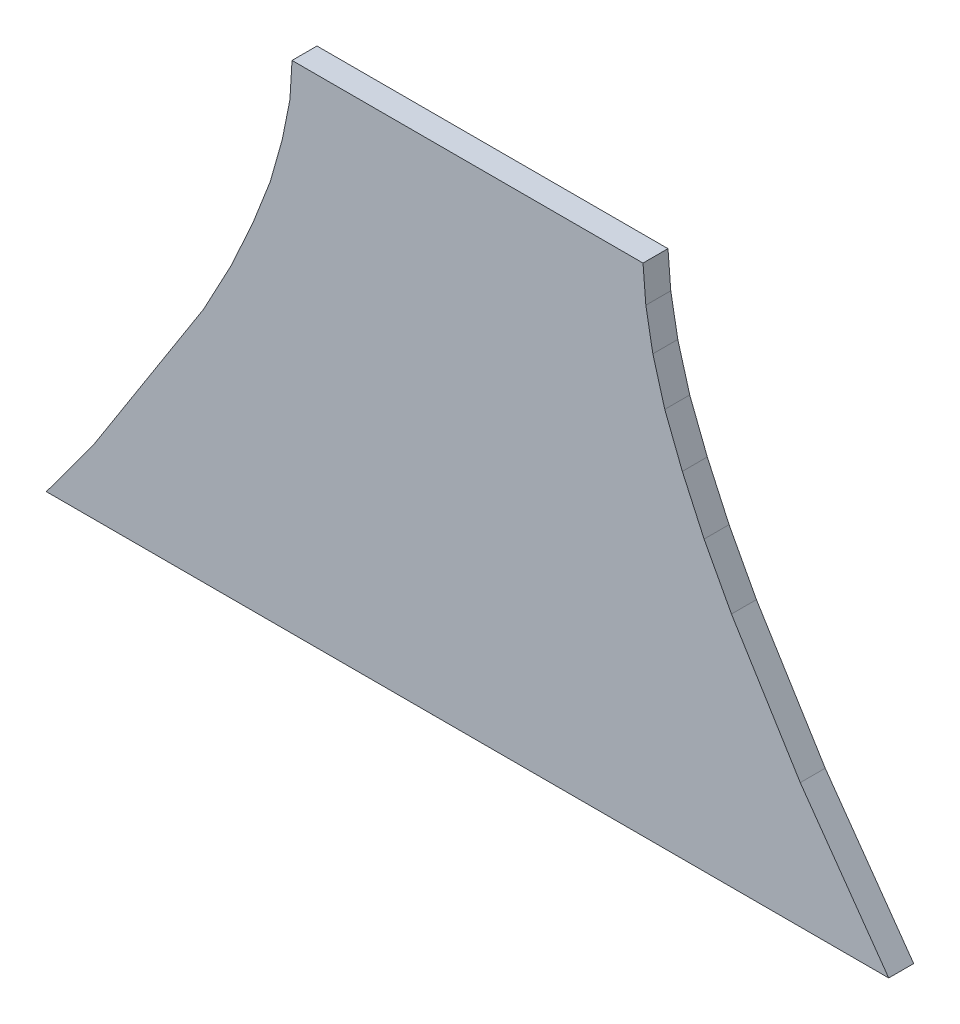
ISO-10303-21;
HEADER;
FILE_DESCRIPTION(('STEP AP214'),'2;1');
FILE_NAME('part.step','',(''),(''),'','','');
FILE_SCHEMA(('AUTOMOTIVE_DESIGN { 1 0 10303 214 1 1 1 1 }'));
ENDSEC;
DATA;
#1=APPLICATION_CONTEXT('core data for automotive mechanical design processes');
#2=APPLICATION_PROTOCOL_DEFINITION('international standard','automotive_design',2000,#1);
#3=PRODUCT_CONTEXT('',#1,'mechanical');
#4=PRODUCT('Part','Part','',(#3));
#5=PRODUCT_RELATED_PRODUCT_CATEGORY('part','',(#4));
#6=PRODUCT_DEFINITION_FORMATION('','',#4);
#7=PRODUCT_DEFINITION_CONTEXT('part definition',#1,'design');
#8=PRODUCT_DEFINITION('design','',#6,#7);
#9=PRODUCT_DEFINITION_SHAPE('','',#8);
#10=(LENGTH_UNIT() NAMED_UNIT(*) SI_UNIT(.MILLI.,.METRE.));
#11=(NAMED_UNIT(*) PLANE_ANGLE_UNIT() SI_UNIT($,.RADIAN.));
#12=(NAMED_UNIT(*) SI_UNIT($,.STERADIAN.) SOLID_ANGLE_UNIT());
#13=UNCERTAINTY_MEASURE_WITH_UNIT(LENGTH_MEASURE(1.E-05),#10,'distance_accuracy_value','');
#14=(GEOMETRIC_REPRESENTATION_CONTEXT(3) GLOBAL_UNCERTAINTY_ASSIGNED_CONTEXT((#13)) GLOBAL_UNIT_ASSIGNED_CONTEXT((#10,
#11,#12)) REPRESENTATION_CONTEXT('',''));
#15=CARTESIAN_POINT('',(0.,0.,0.));
#16=DIRECTION('',(0.,0.,1.));
#17=DIRECTION('',(1.,0.,0.));
#18=AXIS2_PLACEMENT_3D('',#15,#16,#17);
#19=CARTESIAN_POINT('',(67.6500015258789,58.6570014953613,0.));
#20=DIRECTION('',(0.,-1.,0.));
#21=DIRECTION('',(-1.,0.,0.));
#22=AXIS2_PLACEMENT_3D('',#19,#20,#21);
#23=PLANE('',#22);
#24=DIRECTION('',(-1.,0.,0.));
#25=VECTOR('',#24,1.);
#26=CARTESIAN_POINT('',(67.6500015258789,58.6570014953613,0.03556));
#27=LINE('',#26,#25);
#28=CARTESIAN_POINT('',(67.6500015258789,58.6570014953613,0.03556));
#29=VERTEX_POINT('',#28);
#30=CARTESIAN_POINT('',(67.1500015258789,58.6570014953613,0.03556));
#31=VERTEX_POINT('',#30);
#32=EDGE_CURVE('E11',#29,#31,#27,.T.);
#33=ORIENTED_EDGE('',*,*,#32,.F.);
#34=DIRECTION('',(0.,0.,1.));
#35=VECTOR('',#34,1.);
#36=CARTESIAN_POINT('',(67.6500015258789,58.6570014953613,0.));
#37=LINE('',#36,#35);
#38=CARTESIAN_POINT('',(67.6500015258789,58.6570014953613,0.));
#39=VERTEX_POINT('',#38);
#40=EDGE_CURVE('E24',#39,#29,#37,.T.);
#41=ORIENTED_EDGE('',*,*,#40,.F.);
#42=DIRECTION('',(-1.,0.,0.));
#43=VECTOR('',#42,1.);
#44=CARTESIAN_POINT('',(67.6500015258789,58.6570014953613,0.));
#45=LINE('',#44,#43);
#46=CARTESIAN_POINT('',(67.1500015258789,58.6570014953613,0.));
#47=VERTEX_POINT('',#46);
#48=EDGE_CURVE('E311',#39,#47,#45,.T.);
#49=ORIENTED_EDGE('',*,*,#48,.T.);
#50=DIRECTION('',(0.,0.,1.));
#51=VECTOR('',#50,1.);
#52=CARTESIAN_POINT('',(67.1500015258789,58.6570014953613,0.));
#53=LINE('',#52,#51);
#54=EDGE_CURVE('E37',#47,#31,#53,.T.);
#55=ORIENTED_EDGE('',*,*,#54,.T.);
#56=EDGE_LOOP('',(#33,#41,#49,#55));
#57=FACE_BOUND('',#56,.T.);
#58=ADVANCED_FACE('F17',(#57),#23,.F.);
#59=CARTESIAN_POINT('',(67.6539993286133,58.6069984436035,0.));
#60=DIRECTION('',(-0.996819146189682,-0.0796968618558732,0.));
#61=DIRECTION('',(-0.0796968618558732,0.996819146189682,0.));
#62=AXIS2_PLACEMENT_3D('',#59,#60,#61);
#63=PLANE('',#62);
#64=DIRECTION('',(-0.0796968618558732,0.996819146189682,0.));
#65=VECTOR('',#64,1.);
#66=CARTESIAN_POINT('',(67.6539993286133,58.6069984436035,0.03556));
#67=LINE('',#66,#65);
#68=CARTESIAN_POINT('',(67.6539993286133,58.6069984436035,0.03556));
#69=VERTEX_POINT('',#68);
#70=EDGE_CURVE('E307',#69,#29,#67,.T.);
#71=ORIENTED_EDGE('',*,*,#70,.F.);
#72=DIRECTION('',(0.,0.,1.));
#73=VECTOR('',#72,1.);
#74=CARTESIAN_POINT('',(67.6539993286133,58.6069984436035,0.));
#75=LINE('',#74,#73);
#76=CARTESIAN_POINT('',(67.6539993286133,58.6069984436035,0.));
#77=VERTEX_POINT('',#76);
#78=EDGE_CURVE('E305',#77,#69,#75,.T.);
#79=ORIENTED_EDGE('',*,*,#78,.F.);
#80=DIRECTION('',(-0.0796968618558732,0.996819146189682,0.));
#81=VECTOR('',#80,1.);
#82=CARTESIAN_POINT('',(67.6539993286133,58.6069984436035,0.));
#83=LINE('',#82,#81);
#84=EDGE_CURVE('E303',#77,#39,#83,.T.);
#85=ORIENTED_EDGE('',*,*,#84,.T.);
#86=ORIENTED_EDGE('',*,*,#40,.T.);
#87=EDGE_LOOP('',(#71,#79,#85,#86));
#88=FACE_BOUND('',#87,.T.);
#89=ADVANCED_FACE('F314',(#88),#63,.F.);
#90=CARTESIAN_POINT('',(67.6640014648438,58.5519981384277,0.));
#91=DIRECTION('',(-0.983863358539756,-0.178921468032407,0.));
#92=DIRECTION('',(-0.178921468032407,0.983863358539756,0.));
#93=AXIS2_PLACEMENT_3D('',#90,#91,#92);
#94=PLANE('',#93);
#95=DIRECTION('',(-0.178921468032407,0.983863358539756,0.));
#96=VECTOR('',#95,1.);
#97=CARTESIAN_POINT('',(67.6640014648438,58.5519981384277,0.03556));
#98=LINE('',#97,#96);
#99=CARTESIAN_POINT('',(67.6640014648438,58.5519981384277,0.03556));
#100=VERTEX_POINT('',#99);
#101=EDGE_CURVE('E300',#100,#69,#98,.T.);
#102=ORIENTED_EDGE('',*,*,#101,.F.);
#103=DIRECTION('',(0.,0.,1.));
#104=VECTOR('',#103,1.);
#105=CARTESIAN_POINT('',(67.6640014648438,58.5519981384277,0.));
#106=LINE('',#105,#104);
#107=CARTESIAN_POINT('',(67.6640014648438,58.5519981384277,0.));
#108=VERTEX_POINT('',#107);
#109=EDGE_CURVE('E298',#108,#100,#106,.T.);
#110=ORIENTED_EDGE('',*,*,#109,.F.);
#111=DIRECTION('',(-0.178921468032407,0.983863358539756,0.));
#112=VECTOR('',#111,1.);
#113=CARTESIAN_POINT('',(67.6640014648438,58.5519981384277,0.));
#114=LINE('',#113,#112);
#115=EDGE_CURVE('E295',#108,#77,#114,.T.);
#116=ORIENTED_EDGE('',*,*,#115,.T.);
#117=ORIENTED_EDGE('',*,*,#78,.T.);
#118=EDGE_LOOP('',(#102,#110,#116,#117));
#119=FACE_BOUND('',#118,.T.);
#120=ADVANCED_FACE('F317',(#119),#94,.F.);
#121=CARTESIAN_POINT('',(67.6809997558594,58.492000579834,0.));
#122=DIRECTION('',(-0.962131004698203,-0.272587471829552,0.));
#123=DIRECTION('',(-0.272587471829552,0.962131004698203,0.));
#124=AXIS2_PLACEMENT_3D('',#121,#122,#123);
#125=PLANE('',#124);
#126=DIRECTION('',(-0.272587471829552,0.962131004698203,0.));
#127=VECTOR('',#126,1.);
#128=CARTESIAN_POINT('',(67.6809997558594,58.492000579834,0.03556));
#129=LINE('',#128,#127);
#130=CARTESIAN_POINT('',(67.6809997558594,58.492000579834,0.03556));
#131=VERTEX_POINT('',#130);
#132=EDGE_CURVE('E292',#131,#100,#129,.T.);
#133=ORIENTED_EDGE('',*,*,#132,.F.);
#134=DIRECTION('',(0.,0.,1.));
#135=VECTOR('',#134,1.);
#136=CARTESIAN_POINT('',(67.6809997558594,58.492000579834,0.));
#137=LINE('',#136,#135);
#138=CARTESIAN_POINT('',(67.6809997558594,58.492000579834,0.));
#139=VERTEX_POINT('',#138);
#140=EDGE_CURVE('E290',#139,#131,#137,.T.);
#141=ORIENTED_EDGE('',*,*,#140,.F.);
#142=DIRECTION('',(-0.272587471829552,0.962131004698203,0.));
#143=VECTOR('',#142,1.);
#144=CARTESIAN_POINT('',(67.6809997558594,58.492000579834,0.));
#145=LINE('',#144,#143);
#146=EDGE_CURVE('E287',#139,#108,#145,.T.);
#147=ORIENTED_EDGE('',*,*,#146,.T.);
#148=ORIENTED_EDGE('',*,*,#109,.T.);
#149=EDGE_LOOP('',(#133,#141,#147,#148));
#150=FACE_BOUND('',#149,.T.);
#151=ADVANCED_FACE('F322',(#150),#125,.F.);
#152=CARTESIAN_POINT('',(67.7060012817383,58.4280014038086,0.));
#153=DIRECTION('',(-0.931448235122396,-0.363873859032734,0.));
#154=DIRECTION('',(-0.363873859032734,0.931448235122396,0.));
#155=AXIS2_PLACEMENT_3D('',#152,#153,#154);
#156=PLANE('',#155);
#157=DIRECTION('',(-0.363873859032734,0.931448235122396,0.));
#158=VECTOR('',#157,1.);
#159=CARTESIAN_POINT('',(67.7060012817383,58.4280014038086,0.03556));
#160=LINE('',#159,#158);
#161=CARTESIAN_POINT('',(67.7060012817383,58.4280014038086,0.03556));
#162=VERTEX_POINT('',#161);
#163=EDGE_CURVE('E284',#162,#131,#160,.T.);
#164=ORIENTED_EDGE('',*,*,#163,.F.);
#165=DIRECTION('',(0.,0.,1.));
#166=VECTOR('',#165,1.);
#167=CARTESIAN_POINT('',(67.7060012817383,58.4280014038086,0.));
#168=LINE('',#167,#166);
#169=CARTESIAN_POINT('',(67.7060012817383,58.4280014038086,0.));
#170=VERTEX_POINT('',#169);
#171=EDGE_CURVE('E282',#170,#162,#168,.T.);
#172=ORIENTED_EDGE('',*,*,#171,.F.);
#173=DIRECTION('',(-0.363873859032734,0.931448235122396,0.));
#174=VECTOR('',#173,1.);
#175=CARTESIAN_POINT('',(67.7060012817383,58.4280014038086,0.));
#176=LINE('',#175,#174);
#177=EDGE_CURVE('E279',#170,#139,#176,.T.);
#178=ORIENTED_EDGE('',*,*,#177,.T.);
#179=ORIENTED_EDGE('',*,*,#140,.T.);
#180=EDGE_LOOP('',(#164,#172,#178,#179));
#181=FACE_BOUND('',#180,.T.);
#182=ADVANCED_FACE('F325',(#181),#156,.F.);
#183=CARTESIAN_POINT('',(67.7369995117188,58.3600006103516,0.));
#184=DIRECTION('',(-0.909918432077323,-0.414787230958169,0.));
#185=DIRECTION('',(-0.414787230958169,0.909918432077323,0.));
#186=AXIS2_PLACEMENT_3D('',#183,#184,#185);
#187=PLANE('',#186);
#188=DIRECTION('',(-0.414787230958169,0.909918432077323,0.));
#189=VECTOR('',#188,1.);
#190=CARTESIAN_POINT('',(67.7369995117188,58.3600006103516,0.03556));
#191=LINE('',#190,#189);
#192=CARTESIAN_POINT('',(67.7369995117188,58.3600006103516,0.03556));
#193=VERTEX_POINT('',#192);
#194=EDGE_CURVE('E276',#193,#162,#191,.T.);
#195=ORIENTED_EDGE('',*,*,#194,.F.);
#196=DIRECTION('',(0.,0.,1.));
#197=VECTOR('',#196,1.);
#198=CARTESIAN_POINT('',(67.7369995117188,58.3600006103516,0.));
#199=LINE('',#198,#197);
#200=CARTESIAN_POINT('',(67.7369995117188,58.3600006103516,0.));
#201=VERTEX_POINT('',#200);
#202=EDGE_CURVE('E274',#201,#193,#199,.T.);
#203=ORIENTED_EDGE('',*,*,#202,.F.);
#204=DIRECTION('',(-0.414787230958169,0.909918432077323,0.));
#205=VECTOR('',#204,1.);
#206=CARTESIAN_POINT('',(67.7369995117188,58.3600006103516,0.));
#207=LINE('',#206,#205);
#208=EDGE_CURVE('E271',#201,#170,#207,.T.);
#209=ORIENTED_EDGE('',*,*,#208,.T.);
#210=ORIENTED_EDGE('',*,*,#171,.T.);
#211=EDGE_LOOP('',(#195,#203,#209,#210));
#212=FACE_BOUND('',#211,.T.);
#213=ADVANCED_FACE('F330',(#212),#187,.F.);
#214=CARTESIAN_POINT('',(67.7760009765625,58.2869987487793,0.));
#215=DIRECTION('',(-0.882015894581597,-0.471219653352262,0.));
#216=DIRECTION('',(-0.471219653352262,0.882015894581597,0.));
#217=AXIS2_PLACEMENT_3D('',#214,#215,#216);
#218=PLANE('',#217);
#219=DIRECTION('',(-0.471219653352262,0.882015894581597,0.));
#220=VECTOR('',#219,1.);
#221=CARTESIAN_POINT('',(67.7760009765625,58.2869987487793,0.03556));
#222=LINE('',#221,#220);
#223=CARTESIAN_POINT('',(67.7760009765625,58.2869987487793,0.03556));
#224=VERTEX_POINT('',#223);
#225=EDGE_CURVE('E268',#224,#193,#222,.T.);
#226=ORIENTED_EDGE('',*,*,#225,.F.);
#227=DIRECTION('',(0.,0.,1.));
#228=VECTOR('',#227,1.);
#229=CARTESIAN_POINT('',(67.7760009765625,58.2869987487793,0.));
#230=LINE('',#229,#228);
#231=CARTESIAN_POINT('',(67.7760009765625,58.2869987487793,0.));
#232=VERTEX_POINT('',#231);
#233=EDGE_CURVE('E266',#232,#224,#230,.T.);
#234=ORIENTED_EDGE('',*,*,#233,.F.);
#235=DIRECTION('',(-0.471219653352262,0.882015894581597,0.));
#236=VECTOR('',#235,1.);
#237=CARTESIAN_POINT('',(67.7760009765625,58.2869987487793,0.));
#238=LINE('',#237,#236);
#239=EDGE_CURVE('E263',#232,#201,#238,.T.);
#240=ORIENTED_EDGE('',*,*,#239,.T.);
#241=ORIENTED_EDGE('',*,*,#202,.T.);
#242=EDGE_LOOP('',(#226,#234,#240,#241));
#243=FACE_BOUND('',#242,.T.);
#244=ADVANCED_FACE('F333',(#243),#218,.F.);
#245=CARTESIAN_POINT('',(67.8740005493164,58.1279983520508,0.));
#246=DIRECTION('',(-0.851292055089458,-0.524692135391381,0.));
#247=DIRECTION('',(-0.524692135391381,0.851292055089458,0.));
#248=AXIS2_PLACEMENT_3D('',#245,#246,#247);
#249=PLANE('',#248);
#250=DIRECTION('',(-0.524692135391381,0.851292055089458,0.));
#251=VECTOR('',#250,1.);
#252=CARTESIAN_POINT('',(67.8740005493164,58.1279983520508,0.03556));
#253=LINE('',#252,#251);
#254=CARTESIAN_POINT('',(67.8740005493164,58.1279983520508,0.03556));
#255=VERTEX_POINT('',#254);
#256=EDGE_CURVE('E260',#255,#224,#253,.T.);
#257=ORIENTED_EDGE('',*,*,#256,.F.);
#258=DIRECTION('',(0.,0.,1.));
#259=VECTOR('',#258,1.);
#260=CARTESIAN_POINT('',(67.8740005493164,58.1279983520508,0.));
#261=LINE('',#260,#259);
#262=CARTESIAN_POINT('',(67.8740005493164,58.1279983520508,0.));
#263=VERTEX_POINT('',#262);
#264=EDGE_CURVE('E258',#263,#255,#261,.T.);
#265=ORIENTED_EDGE('',*,*,#264,.F.);
#266=DIRECTION('',(-0.524692135391381,0.851292055089458,0.));
#267=VECTOR('',#266,1.);
#268=CARTESIAN_POINT('',(67.8740005493164,58.1279983520508,0.));
#269=LINE('',#268,#267);
#270=EDGE_CURVE('E255',#263,#232,#269,.T.);
#271=ORIENTED_EDGE('',*,*,#270,.T.);
#272=ORIENTED_EDGE('',*,*,#233,.T.);
#273=EDGE_LOOP('',(#257,#265,#271,#272));
#274=FACE_BOUND('',#273,.T.);
#275=ADVANCED_FACE('F338',(#274),#249,.F.);
#276=CARTESIAN_POINT('',(68.,57.9500007629395,0.));
#277=DIRECTION('',(-0.8162021751121,-0.577766396861462,0.));
#278=DIRECTION('',(-0.577766396861462,0.8162021751121,0.));
#279=AXIS2_PLACEMENT_3D('',#276,#277,#278);
#280=PLANE('',#279);
#281=DIRECTION('',(-0.577766396861462,0.8162021751121,0.));
#282=VECTOR('',#281,1.);
#283=CARTESIAN_POINT('',(68.,57.9500007629395,0.03556));
#284=LINE('',#283,#282);
#285=CARTESIAN_POINT('',(68.,57.9500007629395,0.03556));
#286=VERTEX_POINT('',#285);
#287=EDGE_CURVE('E252',#286,#255,#284,.T.);
#288=ORIENTED_EDGE('',*,*,#287,.F.);
#289=DIRECTION('',(0.,0.,1.));
#290=VECTOR('',#289,1.);
#291=CARTESIAN_POINT('',(68.,57.9500007629395,0.));
#292=LINE('',#291,#290);
#293=CARTESIAN_POINT('',(68.,57.9500007629395,0.));
#294=VERTEX_POINT('',#293);
#295=EDGE_CURVE('E250',#294,#286,#292,.T.);
#296=ORIENTED_EDGE('',*,*,#295,.F.);
#297=DIRECTION('',(-0.577766396861462,0.8162021751121,0.));
#298=VECTOR('',#297,1.);
#299=CARTESIAN_POINT('',(68.,57.9500007629395,0.));
#300=LINE('',#299,#298);
#301=EDGE_CURVE('E247',#294,#263,#300,.T.);
#302=ORIENTED_EDGE('',*,*,#301,.T.);
#303=ORIENTED_EDGE('',*,*,#264,.T.);
#304=EDGE_LOOP('',(#288,#296,#302,#303));
#305=FACE_BOUND('',#304,.T.);
#306=ADVANCED_FACE('F341',(#305),#280,.F.);
#307=CARTESIAN_POINT('',(67.4030677195111,57.9500007629395,0.));
#308=DIRECTION('',(0.,1.,0.));
#309=DIRECTION('',(1.,0.,0.));
#310=AXIS2_PLACEMENT_3D('',#307,#308,#309);
#311=PLANE('',#310);
#312=DIRECTION('',(1.,0.,0.));
#313=VECTOR('',#312,1.);
#314=CARTESIAN_POINT('',(66.8000030517578,57.9500007629395,0.03556));
#315=LINE('',#314,#313);
#316=CARTESIAN_POINT('',(67.4030677195111,57.9500007629395,0.03556));
#317=VERTEX_POINT('',#316);
#318=EDGE_CURVE('E244',#317,#286,#315,.T.);
#319=ORIENTED_EDGE('',*,*,#318,.F.);
#320=DIRECTION('',(0.,0.,1.));
#321=VECTOR('',#320,1.);
#322=CARTESIAN_POINT('',(67.4030677195111,57.9500007629395,0.));
#323=LINE('',#322,#321);
#324=CARTESIAN_POINT('',(67.4030677195111,57.9500007629395,0.));
#325=VERTEX_POINT('',#324);
#326=EDGE_CURVE('E242',#325,#317,#323,.T.);
#327=ORIENTED_EDGE('',*,*,#326,.F.);
#328=DIRECTION('',(1.,0.,0.));
#329=VECTOR('',#328,1.);
#330=CARTESIAN_POINT('',(66.8000030517578,57.9500007629395,0.));
#331=LINE('',#330,#329);
#332=EDGE_CURVE('E239',#325,#294,#331,.T.);
#333=ORIENTED_EDGE('',*,*,#332,.T.);
#334=ORIENTED_EDGE('',*,*,#295,.T.);
#335=EDGE_LOOP('',(#319,#327,#333,#334));
#336=FACE_BOUND('',#335,.T.);
#337=ADVANCED_FACE('F346',(#336),#311,.F.);
#338=CARTESIAN_POINT('',(67.4000176,57.500012,0.));
#339=DIRECTION('',(0.,0.,-1.));
#340=DIRECTION('',(1.,0.,0.));
#341=AXIS2_PLACEMENT_3D('',#338,#339,#340);
#342=CYLINDRICAL_SURFACE('',#341,0.4499991);
#343=ORIENTED_EDGE('',*,*,#326,.T.);
#344=CARTESIAN_POINT('',(67.4000176,57.500012,0.03556));
#345=DIRECTION('',(0.,0.,1.));
#346=DIRECTION('',(1.,0.,0.));
#347=AXIS2_PLACEMENT_3D('',#344,#345,#346);
#348=CIRCLE('',#347,0.4499991);
#349=CARTESIAN_POINT('',(67.3969674804895,57.9500007629395,0.03556));
#350=VERTEX_POINT('',#349);
#351=EDGE_CURVE('E236',#317,#350,#348,.T.);
#352=ORIENTED_EDGE('',*,*,#351,.T.);
#353=DIRECTION('',(0.,0.,1.));
#354=VECTOR('',#353,1.);
#355=CARTESIAN_POINT('',(67.3969674804895,57.9500007629395,0.));
#356=LINE('',#355,#354);
#357=CARTESIAN_POINT('',(67.3969674804895,57.9500007629395,0.));
#358=VERTEX_POINT('',#357);
#359=EDGE_CURVE('E234',#358,#350,#356,.T.);
#360=ORIENTED_EDGE('',*,*,#359,.F.);
#361=CARTESIAN_POINT('',(67.4000176,57.500012,0.));
#362=DIRECTION('',(0.,0.,1.));
#363=DIRECTION('',(1.,0.,0.));
#364=AXIS2_PLACEMENT_3D('',#361,#362,#363);
#365=CIRCLE('',#364,0.4499991);
#366=EDGE_CURVE('E231',#325,#358,#365,.T.);
#367=ORIENTED_EDGE('',*,*,#366,.F.);
#368=EDGE_LOOP('',(#343,#352,#360,#367));
#369=FACE_BOUND('',#368,.T.);
#370=ADVANCED_FACE('F349',(#369),#342,.F.);
#371=CARTESIAN_POINT('',(66.8000030517578,57.9500007629395,0.));
#372=DIRECTION('',(0.,1.,0.));
#373=DIRECTION('',(1.,0.,0.));
#374=AXIS2_PLACEMENT_3D('',#371,#372,#373);
#375=PLANE('',#374);
#376=DIRECTION('',(1.,0.,0.));
#377=VECTOR('',#376,1.);
#378=CARTESIAN_POINT('',(66.8000030517578,57.9500007629395,0.03556));
#379=LINE('',#378,#377);
#380=CARTESIAN_POINT('',(66.8000030517578,57.9500007629395,0.03556));
#381=VERTEX_POINT('',#380);
#382=EDGE_CURVE('E228',#381,#350,#379,.T.);
#383=ORIENTED_EDGE('',*,*,#382,.F.);
#384=DIRECTION('',(0.,0.,1.));
#385=VECTOR('',#384,1.);
#386=CARTESIAN_POINT('',(66.8000030517578,57.9500007629395,0.));
#387=LINE('',#386,#385);
#388=CARTESIAN_POINT('',(66.8000030517578,57.9500007629395,0.));
#389=VERTEX_POINT('',#388);
#390=EDGE_CURVE('E226',#389,#381,#387,.T.);
#391=ORIENTED_EDGE('',*,*,#390,.F.);
#392=EDGE_CURVE('E225',#389,#358,#331,.T.);
#393=ORIENTED_EDGE('',*,*,#392,.T.);
#394=ORIENTED_EDGE('',*,*,#359,.T.);
#395=EDGE_LOOP('',(#383,#391,#393,#394));
#396=FACE_BOUND('',#395,.T.);
#397=ADVANCED_FACE('F355',(#396),#375,.F.);
#398=CARTESIAN_POINT('',(66.8669967651367,58.0410003662109,0.));
#399=DIRECTION('',(0.805303529803087,-0.592862736969265,0.));
#400=DIRECTION('',(-0.592862736969265,-0.805303529803087,0.));
#401=AXIS2_PLACEMENT_3D('',#398,#399,#400);
#402=PLANE('',#401);
#403=DIRECTION('',(-0.592862736969265,-0.805303529803087,0.));
#404=VECTOR('',#403,1.);
#405=CARTESIAN_POINT('',(66.8669967651367,58.0410003662109,0.03556));
#406=LINE('',#405,#404);
#407=CARTESIAN_POINT('',(66.8669967651367,58.0410003662109,0.03556));
#408=VERTEX_POINT('',#407);
#409=EDGE_CURVE('E222',#408,#381,#406,.T.);
#410=ORIENTED_EDGE('',*,*,#409,.F.);
#411=DIRECTION('',(0.,0.,1.));
#412=VECTOR('',#411,1.);
#413=CARTESIAN_POINT('',(66.8669967651367,58.0410003662109,0.));
#414=LINE('',#413,#412);
#415=CARTESIAN_POINT('',(66.8669967651367,58.0410003662109,0.));
#416=VERTEX_POINT('',#415);
#417=EDGE_CURVE('E220',#416,#408,#414,.T.);
#418=ORIENTED_EDGE('',*,*,#417,.F.);
#419=DIRECTION('',(-0.592862736969265,-0.805303529803087,0.));
#420=VECTOR('',#419,1.);
#421=CARTESIAN_POINT('',(66.8669967651367,58.0410003662109,0.));
#422=LINE('',#421,#420);
#423=EDGE_CURVE('E217',#416,#389,#422,.T.);
#424=ORIENTED_EDGE('',*,*,#423,.T.);
#425=ORIENTED_EDGE('',*,*,#390,.T.);
#426=EDGE_LOOP('',(#410,#418,#424,#425));
#427=FACE_BOUND('',#426,.T.);
#428=ADVANCED_FACE('F358',(#427),#402,.F.);
#429=CARTESIAN_POINT('',(67.0240020751953,58.2869987487793,0.));
#430=DIRECTION('',(0.842945417216635,-0.537999092558225,0.));
#431=DIRECTION('',(-0.537999092558225,-0.842945417216635,0.));
#432=AXIS2_PLACEMENT_3D('',#429,#430,#431);
#433=PLANE('',#432);
#434=DIRECTION('',(-0.537999092558225,-0.842945417216635,0.));
#435=VECTOR('',#434,1.);
#436=CARTESIAN_POINT('',(67.0240020751953,58.2869987487793,0.03556));
#437=LINE('',#436,#435);
#438=CARTESIAN_POINT('',(67.0240020751953,58.2869987487793,0.03556));
#439=VERTEX_POINT('',#438);
#440=EDGE_CURVE('E214',#439,#408,#437,.T.);
#441=ORIENTED_EDGE('',*,*,#440,.F.);
#442=DIRECTION('',(0.,0.,1.));
#443=VECTOR('',#442,1.);
#444=CARTESIAN_POINT('',(67.0240020751953,58.2869987487793,0.));
#445=LINE('',#444,#443);
#446=CARTESIAN_POINT('',(67.0240020751953,58.2869987487793,0.));
#447=VERTEX_POINT('',#446);
#448=EDGE_CURVE('E212',#447,#439,#445,.T.);
#449=ORIENTED_EDGE('',*,*,#448,.F.);
#450=DIRECTION('',(-0.537999092558225,-0.842945417216635,0.));
#451=VECTOR('',#450,1.);
#452=CARTESIAN_POINT('',(67.0240020751953,58.2869987487793,0.));
#453=LINE('',#452,#451);
#454=EDGE_CURVE('E209',#447,#416,#453,.T.);
#455=ORIENTED_EDGE('',*,*,#454,.T.);
#456=ORIENTED_EDGE('',*,*,#417,.T.);
#457=EDGE_LOOP('',(#441,#449,#455,#456));
#458=FACE_BOUND('',#457,.T.);
#459=ADVANCED_FACE('F363',(#458),#433,.F.);
#460=CARTESIAN_POINT('',(67.0630035400391,58.3600006103516,0.));
#461=DIRECTION('',(0.882015894581597,-0.471219653352262,0.));
#462=DIRECTION('',(-0.471219653352262,-0.882015894581597,0.));
#463=AXIS2_PLACEMENT_3D('',#460,#461,#462);
#464=PLANE('',#463);
#465=DIRECTION('',(-0.471219653352262,-0.882015894581597,0.));
#466=VECTOR('',#465,1.);
#467=CARTESIAN_POINT('',(67.0630035400391,58.3600006103516,0.03556));
#468=LINE('',#467,#466);
#469=CARTESIAN_POINT('',(67.0630035400391,58.3600006103516,0.03556));
#470=VERTEX_POINT('',#469);
#471=EDGE_CURVE('E206',#470,#439,#468,.T.);
#472=ORIENTED_EDGE('',*,*,#471,.F.);
#473=DIRECTION('',(0.,0.,1.));
#474=VECTOR('',#473,1.);
#475=CARTESIAN_POINT('',(67.0630035400391,58.3600006103516,0.));
#476=LINE('',#475,#474);
#477=CARTESIAN_POINT('',(67.0630035400391,58.3600006103516,0.));
#478=VERTEX_POINT('',#477);
#479=EDGE_CURVE('E204',#478,#470,#476,.T.);
#480=ORIENTED_EDGE('',*,*,#479,.F.);
#481=DIRECTION('',(-0.471219653352262,-0.882015894581597,0.));
#482=VECTOR('',#481,1.);
#483=CARTESIAN_POINT('',(67.0630035400391,58.3600006103516,0.));
#484=LINE('',#483,#482);
#485=EDGE_CURVE('E201',#478,#447,#484,.T.);
#486=ORIENTED_EDGE('',*,*,#485,.T.);
#487=ORIENTED_EDGE('',*,*,#448,.T.);
#488=EDGE_LOOP('',(#472,#480,#486,#487));
#489=FACE_BOUND('',#488,.T.);
#490=ADVANCED_FACE('F366',(#489),#464,.F.);
#491=CARTESIAN_POINT('',(67.0940017700195,58.4280014038086,0.));
#492=DIRECTION('',(0.909918432077323,-0.414787230958169,0.));
#493=DIRECTION('',(-0.414787230958169,-0.909918432077323,0.));
#494=AXIS2_PLACEMENT_3D('',#491,#492,#493);
#495=PLANE('',#494);
#496=DIRECTION('',(-0.414787230958169,-0.909918432077323,0.));
#497=VECTOR('',#496,1.);
#498=CARTESIAN_POINT('',(67.0940017700195,58.4280014038086,0.03556));
#499=LINE('',#498,#497);
#500=CARTESIAN_POINT('',(67.0940017700195,58.4280014038086,0.03556));
#501=VERTEX_POINT('',#500);
#502=EDGE_CURVE('E198',#501,#470,#499,.T.);
#503=ORIENTED_EDGE('',*,*,#502,.F.);
#504=DIRECTION('',(0.,0.,1.));
#505=VECTOR('',#504,1.);
#506=CARTESIAN_POINT('',(67.0940017700195,58.4280014038086,0.));
#507=LINE('',#506,#505);
#508=CARTESIAN_POINT('',(67.0940017700195,58.4280014038086,0.));
#509=VERTEX_POINT('',#508);
#510=EDGE_CURVE('E196',#509,#501,#507,.T.);
#511=ORIENTED_EDGE('',*,*,#510,.F.);
#512=DIRECTION('',(-0.414787230958169,-0.909918432077323,0.));
#513=VECTOR('',#512,1.);
#514=CARTESIAN_POINT('',(67.0940017700195,58.4280014038086,0.));
#515=LINE('',#514,#513);
#516=EDGE_CURVE('E193',#509,#478,#515,.T.);
#517=ORIENTED_EDGE('',*,*,#516,.T.);
#518=ORIENTED_EDGE('',*,*,#479,.T.);
#519=EDGE_LOOP('',(#503,#511,#517,#518));
#520=FACE_BOUND('',#519,.T.);
#521=ADVANCED_FACE('F370',(#520),#495,.F.);
#522=CARTESIAN_POINT('',(67.1190032958984,58.492000579834,0.));
#523=DIRECTION('',(0.931448235122396,-0.363873859032734,0.));
#524=DIRECTION('',(-0.363873859032734,-0.931448235122396,0.));
#525=AXIS2_PLACEMENT_3D('',#522,#523,#524);
#526=PLANE('',#525);
#527=DIRECTION('',(-0.363873859032734,-0.931448235122396,0.));
#528=VECTOR('',#527,1.);
#529=CARTESIAN_POINT('',(67.1190032958984,58.492000579834,0.03556));
#530=LINE('',#529,#528);
#531=CARTESIAN_POINT('',(67.1190032958984,58.492000579834,0.03556));
#532=VERTEX_POINT('',#531);
#533=EDGE_CURVE('E190',#532,#501,#530,.T.);
#534=ORIENTED_EDGE('',*,*,#533,.F.);
#535=DIRECTION('',(0.,0.,1.));
#536=VECTOR('',#535,1.);
#537=CARTESIAN_POINT('',(67.1190032958984,58.492000579834,0.));
#538=LINE('',#537,#536);
#539=CARTESIAN_POINT('',(67.1190032958984,58.492000579834,0.));
#540=VERTEX_POINT('',#539);
#541=EDGE_CURVE('E188',#540,#532,#538,.T.);
#542=ORIENTED_EDGE('',*,*,#541,.F.);
#543=DIRECTION('',(-0.363873859032734,-0.931448235122396,0.));
#544=VECTOR('',#543,1.);
#545=CARTESIAN_POINT('',(67.1190032958984,58.492000579834,0.));
#546=LINE('',#545,#544);
#547=EDGE_CURVE('E185',#540,#509,#546,.T.);
#548=ORIENTED_EDGE('',*,*,#547,.T.);
#549=ORIENTED_EDGE('',*,*,#510,.T.);
#550=EDGE_LOOP('',(#534,#542,#548,#549));
#551=FACE_BOUND('',#550,.T.);
#552=ADVANCED_FACE('F373',(#551),#526,.F.);
#553=CARTESIAN_POINT('',(67.1360015869141,58.5519981384277,0.));
#554=DIRECTION('',(0.962131004698203,-0.272587471829552,0.));
#555=DIRECTION('',(-0.272587471829552,-0.962131004698203,0.));
#556=AXIS2_PLACEMENT_3D('',#553,#554,#555);
#557=PLANE('',#556);
#558=DIRECTION('',(-0.272587471829552,-0.962131004698203,0.));
#559=VECTOR('',#558,1.);
#560=CARTESIAN_POINT('',(67.1360015869141,58.5519981384277,0.03556));
#561=LINE('',#560,#559);
#562=CARTESIAN_POINT('',(67.1360015869141,58.5519981384277,0.03556));
#563=VERTEX_POINT('',#562);
#564=EDGE_CURVE('E182',#563,#532,#561,.T.);
#565=ORIENTED_EDGE('',*,*,#564,.F.);
#566=DIRECTION('',(0.,0.,1.));
#567=VECTOR('',#566,1.);
#568=CARTESIAN_POINT('',(67.1360015869141,58.5519981384277,0.));
#569=LINE('',#568,#567);
#570=CARTESIAN_POINT('',(67.1360015869141,58.5519981384277,0.));
#571=VERTEX_POINT('',#570);
#572=EDGE_CURVE('E180',#571,#563,#569,.T.);
#573=ORIENTED_EDGE('',*,*,#572,.F.);
#574=DIRECTION('',(-0.272587471829552,-0.962131004698203,0.));
#575=VECTOR('',#574,1.);
#576=CARTESIAN_POINT('',(67.1360015869141,58.5519981384277,0.));
#577=LINE('',#576,#575);
#578=EDGE_CURVE('E171',#571,#540,#577,.T.);
#579=ORIENTED_EDGE('',*,*,#578,.T.);
#580=ORIENTED_EDGE('',*,*,#541,.T.);
#581=EDGE_LOOP('',(#565,#573,#579,#580));
#582=FACE_BOUND('',#581,.T.);
#583=ADVANCED_FACE('F376',(#582),#557,.F.);
#584=CARTESIAN_POINT('',(67.1470031738281,58.6069984436035,0.));
#585=DIRECTION('',(0.980575443764812,-0.196142292954482,0.));
#586=DIRECTION('',(-0.196142292954482,-0.980575443764812,0.));
#587=AXIS2_PLACEMENT_3D('',#584,#585,#586);
#588=PLANE('',#587);
#589=DIRECTION('',(-0.196142292954482,-0.980575443764812,0.));
#590=VECTOR('',#589,1.);
#591=CARTESIAN_POINT('',(67.1470031738281,58.6069984436035,0.03556));
#592=LINE('',#591,#590);
#593=CARTESIAN_POINT('',(67.1470031738281,58.6069984436035,0.03556));
#594=VERTEX_POINT('',#593);
#595=EDGE_CURVE('E157',#594,#563,#592,.T.);
#596=ORIENTED_EDGE('',*,*,#595,.F.);
#597=DIRECTION('',(0.,0.,1.));
#598=VECTOR('',#597,1.);
#599=CARTESIAN_POINT('',(67.1470031738281,58.6069984436035,0.));
#600=LINE('',#599,#598);
#601=CARTESIAN_POINT('',(67.1470031738281,58.6069984436035,0.));
#602=VERTEX_POINT('',#601);
#603=EDGE_CURVE('E152',#602,#594,#600,.T.);
#604=ORIENTED_EDGE('',*,*,#603,.F.);
#605=DIRECTION('',(-0.196142292954482,-0.980575443764812,0.));
#606=VECTOR('',#605,1.);
#607=CARTESIAN_POINT('',(67.1470031738281,58.6069984436035,0.));
#608=LINE('',#607,#606);
#609=EDGE_CURVE('E155',#602,#571,#608,.T.);
#610=ORIENTED_EDGE('',*,*,#609,.T.);
#611=ORIENTED_EDGE('',*,*,#572,.T.);
#612=EDGE_LOOP('',(#596,#604,#610,#611));
#613=FACE_BOUND('',#612,.T.);
#614=ADVANCED_FACE('F154',(#613),#588,.F.);
#615=CARTESIAN_POINT('',(67.1500015258789,58.6570014953613,0.));
#616=DIRECTION('',(0.998207030126264,-0.0598558686053741,0.));
#617=DIRECTION('',(-0.0598558686053741,-0.998207030126264,0.));
#618=AXIS2_PLACEMENT_3D('',#615,#616,#617);
#619=PLANE('',#618);
#620=DIRECTION('',(-0.0598558686053741,-0.998207030126264,0.));
#621=VECTOR('',#620,1.);
#622=CARTESIAN_POINT('',(67.1500015258789,58.6570014953613,0.03556));
#623=LINE('',#622,#621);
#624=EDGE_CURVE('E172',#31,#594,#623,.T.);
#625=ORIENTED_EDGE('',*,*,#624,.F.);
#626=ORIENTED_EDGE('',*,*,#54,.F.);
#627=DIRECTION('',(-0.0598558686053741,-0.998207030126264,0.));
#628=VECTOR('',#627,1.);
#629=CARTESIAN_POINT('',(67.1500015258789,58.6570014953613,0.));
#630=LINE('',#629,#628);
#631=EDGE_CURVE('E168',#47,#602,#630,.T.);
#632=ORIENTED_EDGE('',*,*,#631,.T.);
#633=ORIENTED_EDGE('',*,*,#603,.T.);
#634=EDGE_LOOP('',(#625,#626,#632,#633));
#635=FACE_BOUND('',#634,.T.);
#636=ADVANCED_FACE('F174',(#635),#619,.F.);
#637=CARTESIAN_POINT('',(67.1500015258789,58.6570014953613,0.));
#638=DIRECTION('',(0.,0.,1.));
#639=DIRECTION('',(1.,0.,0.));
#640=AXIS2_PLACEMENT_3D('',#637,#638,#639);
#641=PLANE('',#640);
#642=ORIENTED_EDGE('',*,*,#631,.F.);
#643=ORIENTED_EDGE('',*,*,#48,.F.);
#644=ORIENTED_EDGE('',*,*,#84,.F.);
#645=ORIENTED_EDGE('',*,*,#115,.F.);
#646=ORIENTED_EDGE('',*,*,#146,.F.);
#647=ORIENTED_EDGE('',*,*,#177,.F.);
#648=ORIENTED_EDGE('',*,*,#208,.F.);
#649=ORIENTED_EDGE('',*,*,#239,.F.);
#650=ORIENTED_EDGE('',*,*,#270,.F.);
#651=ORIENTED_EDGE('',*,*,#301,.F.);
#652=ORIENTED_EDGE('',*,*,#332,.F.);
#653=ORIENTED_EDGE('',*,*,#366,.T.);
#654=ORIENTED_EDGE('',*,*,#392,.F.);
#655=ORIENTED_EDGE('',*,*,#423,.F.);
#656=ORIENTED_EDGE('',*,*,#454,.F.);
#657=ORIENTED_EDGE('',*,*,#485,.F.);
#658=ORIENTED_EDGE('',*,*,#516,.F.);
#659=ORIENTED_EDGE('',*,*,#547,.F.);
#660=ORIENTED_EDGE('',*,*,#578,.F.);
#661=ORIENTED_EDGE('',*,*,#609,.F.);
#662=EDGE_LOOP('',(#642,#643,#644,#645,#646,#647,#648,#649,#650,#651,#652,#653,#654,#655,#656,
#657,#658,#659,#660,#661));
#663=FACE_BOUND('',#662,.T.);
#664=ADVANCED_FACE('F166',(#663),#641,.F.);
#665=CARTESIAN_POINT('',(67.1500015258789,58.6570014953613,0.03556));
#666=DIRECTION('',(0.,0.,1.));
#667=DIRECTION('',(1.,0.,0.));
#668=AXIS2_PLACEMENT_3D('',#665,#666,#667);
#669=PLANE('',#668);
#670=ORIENTED_EDGE('',*,*,#32,.T.);
#671=ORIENTED_EDGE('',*,*,#624,.T.);
#672=ORIENTED_EDGE('',*,*,#595,.T.);
#673=ORIENTED_EDGE('',*,*,#564,.T.);
#674=ORIENTED_EDGE('',*,*,#533,.T.);
#675=ORIENTED_EDGE('',*,*,#502,.T.);
#676=ORIENTED_EDGE('',*,*,#471,.T.);
#677=ORIENTED_EDGE('',*,*,#440,.T.);
#678=ORIENTED_EDGE('',*,*,#409,.T.);
#679=ORIENTED_EDGE('',*,*,#382,.T.);
#680=ORIENTED_EDGE('',*,*,#351,.F.);
#681=ORIENTED_EDGE('',*,*,#318,.T.);
#682=ORIENTED_EDGE('',*,*,#287,.T.);
#683=ORIENTED_EDGE('',*,*,#256,.T.);
#684=ORIENTED_EDGE('',*,*,#225,.T.);
#685=ORIENTED_EDGE('',*,*,#194,.T.);
#686=ORIENTED_EDGE('',*,*,#163,.T.);
#687=ORIENTED_EDGE('',*,*,#132,.T.);
#688=ORIENTED_EDGE('',*,*,#101,.T.);
#689=ORIENTED_EDGE('',*,*,#70,.T.);
#690=EDGE_LOOP('',(#670,#671,#672,#673,#674,#675,#676,#677,#678,#679,#680,#681,#682,#683,#684,
#685,#686,#687,#688,#689));
#691=FACE_BOUND('',#690,.T.);
#692=ADVANCED_FACE('F378',(#691),#669,.T.);
#693=CLOSED_SHELL('',(#58,#89,#120,#151,#182,#213,#244,#275,#306,#337,#370,#397,#428,#459,#490,
#521,#552,#583,#614,#636,#664,#692));
#694=MANIFOLD_SOLID_BREP('B1',#693);
#695=ADVANCED_BREP_SHAPE_REPRESENTATION('',(#18,#694),#14);
#696=SHAPE_DEFINITION_REPRESENTATION(#9,#695);
ENDSEC;
END-ISO-10303-21;
